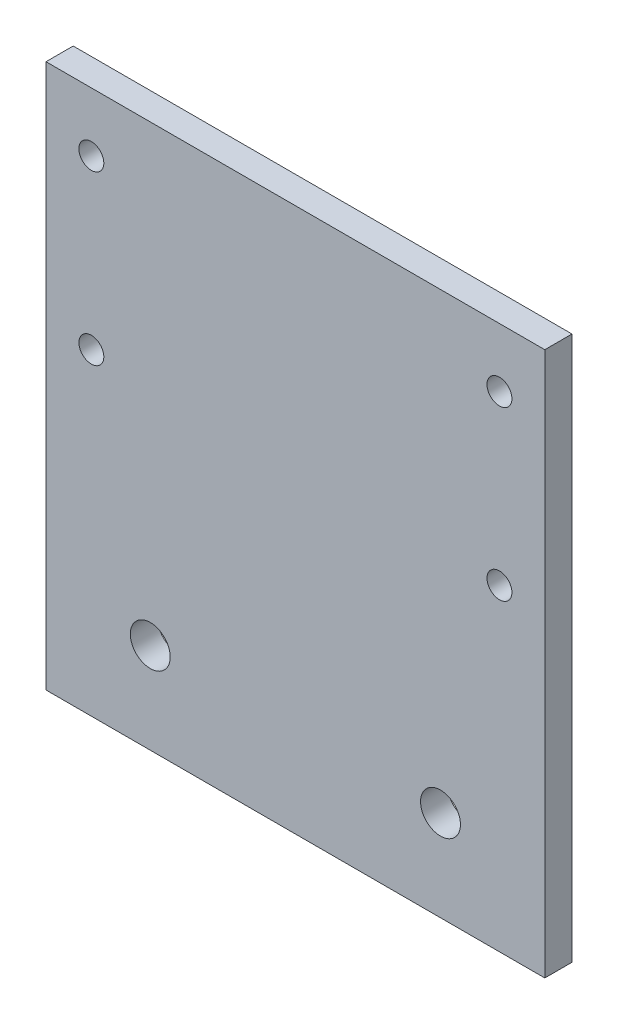
ISO-10303-21;
HEADER;
FILE_DESCRIPTION(('STEP AP214'),'2;1');
FILE_NAME('part.step','',(''),(''),'','','');
FILE_SCHEMA(('AUTOMOTIVE_DESIGN { 1 0 10303 214 1 1 1 1 }'));
ENDSEC;
DATA;
#1=APPLICATION_CONTEXT('core data for automotive mechanical design processes');
#2=APPLICATION_PROTOCOL_DEFINITION('international standard','automotive_design',2000,#1);
#3=PRODUCT_CONTEXT('',#1,'mechanical');
#4=PRODUCT('Part','Part','',(#3));
#5=PRODUCT_RELATED_PRODUCT_CATEGORY('part','',(#4));
#6=PRODUCT_DEFINITION_FORMATION('','',#4);
#7=PRODUCT_DEFINITION_CONTEXT('part definition',#1,'design');
#8=PRODUCT_DEFINITION('design','',#6,#7);
#9=PRODUCT_DEFINITION_SHAPE('','',#8);
#10=(LENGTH_UNIT() NAMED_UNIT(*) SI_UNIT(.MILLI.,.METRE.));
#11=(NAMED_UNIT(*) PLANE_ANGLE_UNIT() SI_UNIT($,.RADIAN.));
#12=(NAMED_UNIT(*) SI_UNIT($,.STERADIAN.) SOLID_ANGLE_UNIT());
#13=UNCERTAINTY_MEASURE_WITH_UNIT(LENGTH_MEASURE(1.E-05),#10,'distance_accuracy_value','');
#14=(GEOMETRIC_REPRESENTATION_CONTEXT(3) GLOBAL_UNCERTAINTY_ASSIGNED_CONTEXT((#13)) GLOBAL_UNIT_ASSIGNED_CONTEXT((#10,
#11,#12)) REPRESENTATION_CONTEXT('',''));
#15=CARTESIAN_POINT('',(0.,0.,0.));
#16=DIRECTION('',(0.,0.,1.));
#17=DIRECTION('',(1.,0.,0.));
#18=AXIS2_PLACEMENT_3D('',#15,#16,#17);
#19=CARTESIAN_POINT('',(0.,0.,3.));
#20=DIRECTION('',(0.,0.,-1.));
#21=DIRECTION('',(-1.,0.,0.));
#22=AXIS2_PLACEMENT_3D('',#19,#20,#21);
#23=PLANE('',#22);
#24=DIRECTION('',(0.,-1.,0.));
#25=VECTOR('',#24,1.);
#26=CARTESIAN_POINT('',(0.,0.,3.));
#27=LINE('',#26,#25);
#28=CARTESIAN_POINT('',(0.,60.,3.));
#29=VERTEX_POINT('',#28);
#30=CARTESIAN_POINT('',(0.,0.,3.));
#31=VERTEX_POINT('',#30);
#32=EDGE_CURVE('E92',#29,#31,#27,.T.);
#33=ORIENTED_EDGE('',*,*,#32,.T.);
#34=DIRECTION('',(1.,0.,0.));
#35=VECTOR('',#34,1.);
#36=CARTESIAN_POINT('',(0.,0.,3.));
#37=LINE('',#36,#35);
#38=CARTESIAN_POINT('',(55.,0.,3.));
#39=VERTEX_POINT('',#38);
#40=EDGE_CURVE('E87',#31,#39,#37,.T.);
#41=ORIENTED_EDGE('',*,*,#40,.T.);
#42=DIRECTION('',(0.,1.,0.));
#43=VECTOR('',#42,1.);
#44=CARTESIAN_POINT('',(55.,0.,3.));
#45=LINE('',#44,#43);
#46=CARTESIAN_POINT('',(55.,60.,3.));
#47=VERTEX_POINT('',#46);
#48=EDGE_CURVE('E90',#39,#47,#45,.T.);
#49=ORIENTED_EDGE('',*,*,#48,.T.);
#50=DIRECTION('',(-1.,0.,0.));
#51=VECTOR('',#50,1.);
#52=CARTESIAN_POINT('',(0.,60.,3.));
#53=LINE('',#52,#51);
#54=EDGE_CURVE('E57',#47,#29,#53,.T.);
#55=ORIENTED_EDGE('',*,*,#54,.T.);
#56=EDGE_LOOP('',(#33,#41,#49,#55));
#57=FACE_BOUND('',#56,.T.);
#58=CARTESIAN_POINT('',(4.99999999999999,53.5,3.));
#59=DIRECTION('',(0.,0.,1.));
#60=DIRECTION('',(1.,0.,0.));
#61=AXIS2_PLACEMENT_3D('',#58,#59,#60);
#62=CIRCLE('',#61,1.375);
#63=CARTESIAN_POINT('',(6.37499999999999,53.5,3.));
#64=VERTEX_POINT('',#63);
#65=EDGE_CURVE('E112',#64,#64,#62,.T.);
#66=ORIENTED_EDGE('',*,*,#65,.F.);
#67=EDGE_LOOP('',(#66));
#68=FACE_BOUND('',#67,.T.);
#69=CARTESIAN_POINT('',(11.5,9.99999999999999,3.));
#70=DIRECTION('',(0.,0.,1.));
#71=DIRECTION('',(1.,0.,0.));
#72=AXIS2_PLACEMENT_3D('',#69,#70,#71);
#73=CIRCLE('',#72,2.2);
#74=CARTESIAN_POINT('',(13.7,9.99999999999999,3.));
#75=VERTEX_POINT('',#74);
#76=EDGE_CURVE('E134',#75,#75,#73,.T.);
#77=ORIENTED_EDGE('',*,*,#76,.F.);
#78=EDGE_LOOP('',(#77));
#79=FACE_BOUND('',#78,.T.);
#80=CARTESIAN_POINT('',(50.,53.5,3.));
#81=DIRECTION('',(0.,0.,1.));
#82=DIRECTION('',(1.,0.,0.));
#83=AXIS2_PLACEMENT_3D('',#80,#81,#82);
#84=CIRCLE('',#83,1.375);
#85=CARTESIAN_POINT('',(51.375,53.5,3.));
#86=VERTEX_POINT('',#85);
#87=EDGE_CURVE('E142',#86,#86,#84,.T.);
#88=ORIENTED_EDGE('',*,*,#87,.F.);
#89=EDGE_LOOP('',(#88));
#90=FACE_BOUND('',#89,.T.);
#91=CARTESIAN_POINT('',(50.0000000000004,35.,3.));
#92=DIRECTION('',(0.,0.,1.));
#93=DIRECTION('',(1.,0.,0.));
#94=AXIS2_PLACEMENT_3D('',#91,#92,#93);
#95=CIRCLE('',#94,1.375);
#96=CARTESIAN_POINT('',(51.3750000000004,35.,3.));
#97=VERTEX_POINT('',#96);
#98=EDGE_CURVE('E150',#97,#97,#95,.T.);
#99=ORIENTED_EDGE('',*,*,#98,.F.);
#100=EDGE_LOOP('',(#99));
#101=FACE_BOUND('',#100,.T.);
#102=CARTESIAN_POINT('',(5.00000000000045,35.,3.));
#103=DIRECTION('',(0.,0.,1.));
#104=DIRECTION('',(1.,0.,0.));
#105=AXIS2_PLACEMENT_3D('',#102,#103,#104);
#106=CIRCLE('',#105,1.375);
#107=CARTESIAN_POINT('',(6.37500000000045,35.,3.));
#108=VERTEX_POINT('',#107);
#109=EDGE_CURVE('E158',#108,#108,#106,.T.);
#110=ORIENTED_EDGE('',*,*,#109,.F.);
#111=EDGE_LOOP('',(#110));
#112=FACE_BOUND('',#111,.T.);
#113=CARTESIAN_POINT('',(43.5,10.,3.));
#114=DIRECTION('',(0.,0.,1.));
#115=DIRECTION('',(1.,0.,0.));
#116=AXIS2_PLACEMENT_3D('',#113,#114,#115);
#117=CIRCLE('',#116,2.2);
#118=CARTESIAN_POINT('',(45.7,10.,3.));
#119=VERTEX_POINT('',#118);
#120=EDGE_CURVE('E166',#119,#119,#117,.T.);
#121=ORIENTED_EDGE('',*,*,#120,.F.);
#122=EDGE_LOOP('',(#121));
#123=FACE_BOUND('',#122,.T.);
#124=ADVANCED_FACE('F39',(#57,#68,#79,#90,#101,#112,#123),#23,.F.);
#125=CARTESIAN_POINT('',(0.,0.,0.));
#126=DIRECTION('',(0.,0.,-1.));
#127=DIRECTION('',(-1.,0.,0.));
#128=AXIS2_PLACEMENT_3D('',#125,#126,#127);
#129=PLANE('',#128);
#130=CARTESIAN_POINT('',(5.00000000000045,35.,0.));
#131=DIRECTION('',(0.,0.,1.));
#132=DIRECTION('',(1.,0.,0.));
#133=AXIS2_PLACEMENT_3D('',#130,#131,#132);
#134=CIRCLE('',#133,1.375);
#135=CARTESIAN_POINT('',(6.37500000000045,35.,0.));
#136=VERTEX_POINT('',#135);
#137=EDGE_CURVE('E162',#136,#136,#134,.T.);
#138=ORIENTED_EDGE('',*,*,#137,.T.);
#139=EDGE_LOOP('',(#138));
#140=FACE_BOUND('',#139,.T.);
#141=CARTESIAN_POINT('',(50.,53.5,0.));
#142=DIRECTION('',(0.,0.,1.));
#143=DIRECTION('',(1.,0.,0.));
#144=AXIS2_PLACEMENT_3D('',#141,#142,#143);
#145=CIRCLE('',#144,1.375);
#146=CARTESIAN_POINT('',(51.375,53.5,0.));
#147=VERTEX_POINT('',#146);
#148=EDGE_CURVE('E146',#147,#147,#145,.T.);
#149=ORIENTED_EDGE('',*,*,#148,.T.);
#150=EDGE_LOOP('',(#149));
#151=FACE_BOUND('',#150,.T.);
#152=CARTESIAN_POINT('',(4.99999999999999,53.5,0.));
#153=DIRECTION('',(0.,0.,1.));
#154=DIRECTION('',(1.,0.,0.));
#155=AXIS2_PLACEMENT_3D('',#152,#153,#154);
#156=CIRCLE('',#155,1.375);
#157=CARTESIAN_POINT('',(6.37499999999999,53.5,0.));
#158=VERTEX_POINT('',#157);
#159=EDGE_CURVE('E130',#158,#158,#156,.T.);
#160=ORIENTED_EDGE('',*,*,#159,.T.);
#161=EDGE_LOOP('',(#160));
#162=FACE_BOUND('',#161,.T.);
#163=DIRECTION('',(0.,-1.,0.));
#164=VECTOR('',#163,1.);
#165=CARTESIAN_POINT('',(0.,0.,0.));
#166=LINE('',#165,#164);
#167=CARTESIAN_POINT('',(0.,60.,0.));
#168=VERTEX_POINT('',#167);
#169=CARTESIAN_POINT('',(0.,0.,0.));
#170=VERTEX_POINT('',#169);
#171=EDGE_CURVE('E108',#168,#170,#166,.T.);
#172=ORIENTED_EDGE('',*,*,#171,.F.);
#173=DIRECTION('',(-1.,0.,0.));
#174=VECTOR('',#173,1.);
#175=CARTESIAN_POINT('',(0.,60.,0.));
#176=LINE('',#175,#174);
#177=CARTESIAN_POINT('',(55.,60.,0.));
#178=VERTEX_POINT('',#177);
#179=EDGE_CURVE('E80',#178,#168,#176,.T.);
#180=ORIENTED_EDGE('',*,*,#179,.F.);
#181=DIRECTION('',(0.,1.,0.));
#182=VECTOR('',#181,1.);
#183=CARTESIAN_POINT('',(55.,0.,0.));
#184=LINE('',#183,#182);
#185=CARTESIAN_POINT('',(55.,0.,0.));
#186=VERTEX_POINT('',#185);
#187=EDGE_CURVE('E74',#186,#178,#184,.T.);
#188=ORIENTED_EDGE('',*,*,#187,.F.);
#189=DIRECTION('',(1.,0.,0.));
#190=VECTOR('',#189,1.);
#191=CARTESIAN_POINT('',(0.,0.,0.));
#192=LINE('',#191,#190);
#193=EDGE_CURVE('E97',#170,#186,#192,.T.);
#194=ORIENTED_EDGE('',*,*,#193,.F.);
#195=EDGE_LOOP('',(#172,#180,#188,#194));
#196=FACE_BOUND('',#195,.T.);
#197=CARTESIAN_POINT('',(11.5,9.99999999999999,0.));
#198=DIRECTION('',(0.,0.,1.));
#199=DIRECTION('',(1.,0.,0.));
#200=AXIS2_PLACEMENT_3D('',#197,#198,#199);
#201=CIRCLE('',#200,2.2);
#202=CARTESIAN_POINT('',(13.7,9.99999999999999,0.));
#203=VERTEX_POINT('',#202);
#204=EDGE_CURVE('E138',#203,#203,#201,.T.);
#205=ORIENTED_EDGE('',*,*,#204,.T.);
#206=EDGE_LOOP('',(#205));
#207=FACE_BOUND('',#206,.T.);
#208=CARTESIAN_POINT('',(50.0000000000004,35.,0.));
#209=DIRECTION('',(0.,0.,1.));
#210=DIRECTION('',(1.,0.,0.));
#211=AXIS2_PLACEMENT_3D('',#208,#209,#210);
#212=CIRCLE('',#211,1.375);
#213=CARTESIAN_POINT('',(51.3750000000004,35.,0.));
#214=VERTEX_POINT('',#213);
#215=EDGE_CURVE('E154',#214,#214,#212,.T.);
#216=ORIENTED_EDGE('',*,*,#215,.T.);
#217=EDGE_LOOP('',(#216));
#218=FACE_BOUND('',#217,.T.);
#219=CARTESIAN_POINT('',(43.5,10.,0.));
#220=DIRECTION('',(0.,0.,1.));
#221=DIRECTION('',(1.,0.,0.));
#222=AXIS2_PLACEMENT_3D('',#219,#220,#221);
#223=CIRCLE('',#222,2.2);
#224=CARTESIAN_POINT('',(45.7,10.,0.));
#225=VERTEX_POINT('',#224);
#226=EDGE_CURVE('E170',#225,#225,#223,.T.);
#227=ORIENTED_EDGE('',*,*,#226,.T.);
#228=EDGE_LOOP('',(#227));
#229=FACE_BOUND('',#228,.T.);
#230=ADVANCED_FACE('F125',(#140,#151,#162,#196,#207,#218,#229),#129,.T.);
#231=CARTESIAN_POINT('',(0.,0.,3.));
#232=DIRECTION('',(1.,0.,0.));
#233=DIRECTION('',(0.,0.,-1.));
#234=AXIS2_PLACEMENT_3D('',#231,#232,#233);
#235=PLANE('',#234);
#236=ORIENTED_EDGE('',*,*,#171,.T.);
#237=DIRECTION('',(0.,0.,-1.));
#238=VECTOR('',#237,1.);
#239=CARTESIAN_POINT('',(0.,0.,3.));
#240=LINE('',#239,#238);
#241=EDGE_CURVE('E11',#31,#170,#240,.T.);
#242=ORIENTED_EDGE('',*,*,#241,.F.);
#243=ORIENTED_EDGE('',*,*,#32,.F.);
#244=DIRECTION('',(0.,0.,-1.));
#245=VECTOR('',#244,1.);
#246=CARTESIAN_POINT('',(0.,60.,3.));
#247=LINE('',#246,#245);
#248=EDGE_CURVE('E104',#29,#168,#247,.T.);
#249=ORIENTED_EDGE('',*,*,#248,.T.);
#250=EDGE_LOOP('',(#236,#242,#243,#249));
#251=FACE_BOUND('',#250,.T.);
#252=ADVANCED_FACE('F41',(#251),#235,.F.);
#253=CARTESIAN_POINT('',(0.,0.,3.));
#254=DIRECTION('',(0.,1.,0.));
#255=DIRECTION('',(-1.,0.,0.));
#256=AXIS2_PLACEMENT_3D('',#253,#254,#255);
#257=PLANE('',#256);
#258=ORIENTED_EDGE('',*,*,#193,.T.);
#259=DIRECTION('',(0.,0.,-1.));
#260=VECTOR('',#259,1.);
#261=CARTESIAN_POINT('',(55.,0.,3.));
#262=LINE('',#261,#260);
#263=EDGE_CURVE('E49',#39,#186,#262,.T.);
#264=ORIENTED_EDGE('',*,*,#263,.F.);
#265=ORIENTED_EDGE('',*,*,#40,.F.);
#266=ORIENTED_EDGE('',*,*,#241,.T.);
#267=EDGE_LOOP('',(#258,#264,#265,#266));
#268=FACE_BOUND('',#267,.T.);
#269=ADVANCED_FACE('F96',(#268),#257,.F.);
#270=CARTESIAN_POINT('',(55.,0.,3.));
#271=DIRECTION('',(-1.,0.,0.));
#272=DIRECTION('',(0.,-1.,0.));
#273=AXIS2_PLACEMENT_3D('',#270,#271,#272);
#274=PLANE('',#273);
#275=ORIENTED_EDGE('',*,*,#187,.T.);
#276=DIRECTION('',(0.,0.,-1.));
#277=VECTOR('',#276,1.);
#278=CARTESIAN_POINT('',(55.,60.,3.));
#279=LINE('',#278,#277);
#280=EDGE_CURVE('E99',#47,#178,#279,.T.);
#281=ORIENTED_EDGE('',*,*,#280,.F.);
#282=ORIENTED_EDGE('',*,*,#48,.F.);
#283=ORIENTED_EDGE('',*,*,#263,.T.);
#284=EDGE_LOOP('',(#275,#281,#282,#283));
#285=FACE_BOUND('',#284,.T.);
#286=ADVANCED_FACE('F100',(#285),#274,.F.);
#287=CARTESIAN_POINT('',(0.,60.,3.));
#288=DIRECTION('',(0.,-1.,0.));
#289=DIRECTION('',(1.,0.,0.));
#290=AXIS2_PLACEMENT_3D('',#287,#288,#289);
#291=PLANE('',#290);
#292=ORIENTED_EDGE('',*,*,#179,.T.);
#293=ORIENTED_EDGE('',*,*,#248,.F.);
#294=ORIENTED_EDGE('',*,*,#54,.F.);
#295=ORIENTED_EDGE('',*,*,#280,.T.);
#296=EDGE_LOOP('',(#292,#293,#294,#295));
#297=FACE_BOUND('',#296,.T.);
#298=ADVANCED_FACE('F122',(#297),#291,.F.);
#299=CARTESIAN_POINT('',(4.99999999999999,53.5,3.));
#300=DIRECTION('',(0.,0.,-1.));
#301=DIRECTION('',(-1.,0.,0.));
#302=AXIS2_PLACEMENT_3D('',#299,#300,#301);
#303=CYLINDRICAL_SURFACE('',#302,1.375);
#304=ORIENTED_EDGE('',*,*,#65,.T.);
#305=EDGE_LOOP('',(#304));
#306=FACE_BOUND('',#305,.T.);
#307=ORIENTED_EDGE('',*,*,#159,.F.);
#308=EDGE_LOOP('',(#307));
#309=FACE_BOUND('',#308,.T.);
#310=ADVANCED_FACE('F189',(#306,#309),#303,.F.);
#311=CARTESIAN_POINT('',(11.5,9.99999999999999,3.));
#312=DIRECTION('',(0.,0.,-1.));
#313=DIRECTION('',(-1.,0.,0.));
#314=AXIS2_PLACEMENT_3D('',#311,#312,#313);
#315=CYLINDRICAL_SURFACE('',#314,2.2);
#316=ORIENTED_EDGE('',*,*,#76,.T.);
#317=EDGE_LOOP('',(#316));
#318=FACE_BOUND('',#317,.T.);
#319=ORIENTED_EDGE('',*,*,#204,.F.);
#320=EDGE_LOOP('',(#319));
#321=FACE_BOUND('',#320,.T.);
#322=ADVANCED_FACE('F235',(#318,#321),#315,.F.);
#323=CARTESIAN_POINT('',(50.,53.5,3.));
#324=DIRECTION('',(0.,0.,-1.));
#325=DIRECTION('',(-1.,0.,0.));
#326=AXIS2_PLACEMENT_3D('',#323,#324,#325);
#327=CYLINDRICAL_SURFACE('',#326,1.375);
#328=ORIENTED_EDGE('',*,*,#87,.T.);
#329=EDGE_LOOP('',(#328));
#330=FACE_BOUND('',#329,.T.);
#331=ORIENTED_EDGE('',*,*,#148,.F.);
#332=EDGE_LOOP('',(#331));
#333=FACE_BOUND('',#332,.T.);
#334=ADVANCED_FACE('F243',(#330,#333),#327,.F.);
#335=CARTESIAN_POINT('',(50.0000000000004,35.,3.));
#336=DIRECTION('',(0.,0.,-1.));
#337=DIRECTION('',(-1.,0.,0.));
#338=AXIS2_PLACEMENT_3D('',#335,#336,#337);
#339=CYLINDRICAL_SURFACE('',#338,1.375);
#340=ORIENTED_EDGE('',*,*,#98,.T.);
#341=EDGE_LOOP('',(#340));
#342=FACE_BOUND('',#341,.T.);
#343=ORIENTED_EDGE('',*,*,#215,.F.);
#344=EDGE_LOOP('',(#343));
#345=FACE_BOUND('',#344,.T.);
#346=ADVANCED_FACE('F251',(#342,#345),#339,.F.);
#347=CARTESIAN_POINT('',(5.00000000000045,35.,3.));
#348=DIRECTION('',(0.,0.,-1.));
#349=DIRECTION('',(-1.,0.,0.));
#350=AXIS2_PLACEMENT_3D('',#347,#348,#349);
#351=CYLINDRICAL_SURFACE('',#350,1.375);
#352=ORIENTED_EDGE('',*,*,#109,.T.);
#353=EDGE_LOOP('',(#352));
#354=FACE_BOUND('',#353,.T.);
#355=ORIENTED_EDGE('',*,*,#137,.F.);
#356=EDGE_LOOP('',(#355));
#357=FACE_BOUND('',#356,.T.);
#358=ADVANCED_FACE('F260',(#354,#357),#351,.F.);
#359=CARTESIAN_POINT('',(43.5,10.,3.));
#360=DIRECTION('',(0.,0.,-1.));
#361=DIRECTION('',(-1.,0.,0.));
#362=AXIS2_PLACEMENT_3D('',#359,#360,#361);
#363=CYLINDRICAL_SURFACE('',#362,2.2);
#364=ORIENTED_EDGE('',*,*,#120,.T.);
#365=EDGE_LOOP('',(#364));
#366=FACE_BOUND('',#365,.T.);
#367=ORIENTED_EDGE('',*,*,#226,.F.);
#368=EDGE_LOOP('',(#367));
#369=FACE_BOUND('',#368,.T.);
#370=ADVANCED_FACE('F178',(#366,#369),#363,.F.);
#371=CLOSED_SHELL('',(#124,#230,#252,#269,#286,#298,#310,#322,#334,#346,#358,#370));
#372=MANIFOLD_SOLID_BREP('B2',#371);
#373=ADVANCED_BREP_SHAPE_REPRESENTATION('',(#18,#372),#14);
#374=SHAPE_DEFINITION_REPRESENTATION(#9,#373);
ENDSEC;
END-ISO-10303-21;
